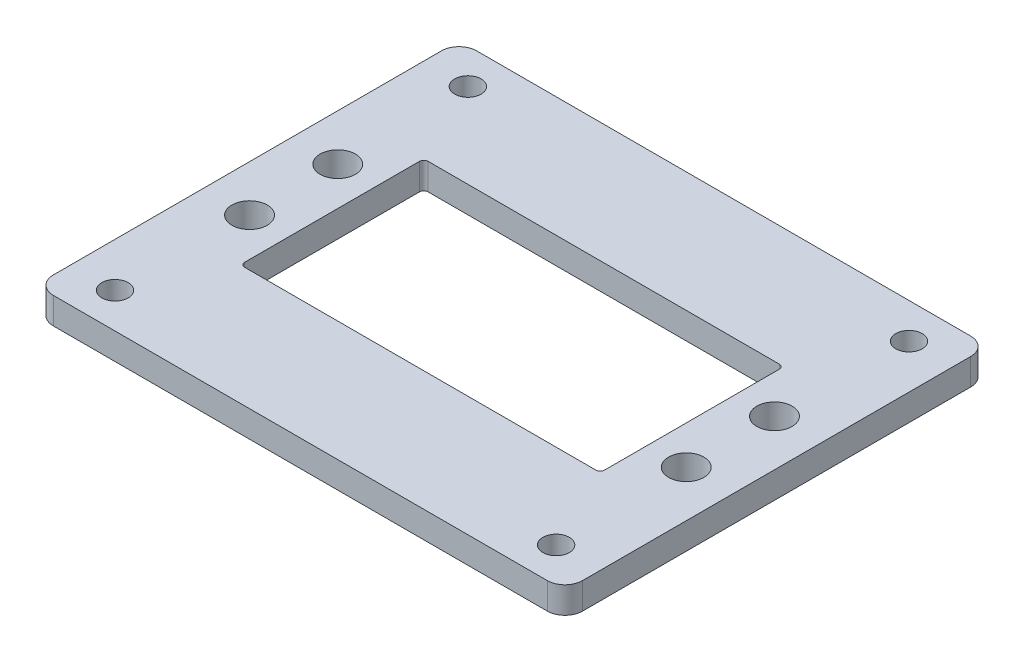
ISO-10303-21;
HEADER;
FILE_DESCRIPTION(('STEP AP214'),'2;1');
FILE_NAME('part.step','',(''),(''),'','','');
FILE_SCHEMA(('AUTOMOTIVE_DESIGN { 1 0 10303 214 1 1 1 1 }'));
ENDSEC;
DATA;
#1=APPLICATION_CONTEXT('core data for automotive mechanical design processes');
#2=APPLICATION_PROTOCOL_DEFINITION('international standard','automotive_design',2000,#1);
#3=PRODUCT_CONTEXT('',#1,'mechanical');
#4=PRODUCT('Part','Part','',(#3));
#5=PRODUCT_RELATED_PRODUCT_CATEGORY('part','',(#4));
#6=PRODUCT_DEFINITION_FORMATION('','',#4);
#7=PRODUCT_DEFINITION_CONTEXT('part definition',#1,'design');
#8=PRODUCT_DEFINITION('design','',#6,#7);
#9=PRODUCT_DEFINITION_SHAPE('','',#8);
#10=(LENGTH_UNIT() NAMED_UNIT(*) SI_UNIT(.MILLI.,.METRE.));
#11=(NAMED_UNIT(*) PLANE_ANGLE_UNIT() SI_UNIT($,.RADIAN.));
#12=(NAMED_UNIT(*) SI_UNIT($,.STERADIAN.) SOLID_ANGLE_UNIT());
#13=UNCERTAINTY_MEASURE_WITH_UNIT(LENGTH_MEASURE(1.E-05),#10,'distance_accuracy_value','');
#14=(GEOMETRIC_REPRESENTATION_CONTEXT(3) GLOBAL_UNCERTAINTY_ASSIGNED_CONTEXT((#13)) GLOBAL_UNIT_ASSIGNED_CONTEXT((#10,
#11,#12)) REPRESENTATION_CONTEXT('',''));
#15=CARTESIAN_POINT('',(0.,0.,0.));
#16=DIRECTION('',(0.,0.,1.));
#17=DIRECTION('',(1.,0.,0.));
#18=AXIS2_PLACEMENT_3D('',#15,#16,#17);
#19=CARTESIAN_POINT('',(0.,3.,0.));
#20=DIRECTION('',(0.,-1.,0.));
#21=DIRECTION('',(0.,0.,-1.));
#22=AXIS2_PLACEMENT_3D('',#19,#20,#21);
#23=PLANE('',#22);
#24=CARTESIAN_POINT('',(24.75,3.,-5.00000000000001));
#25=DIRECTION('',(0.,1.,0.));
#26=DIRECTION('',(0.,0.,1.));
#27=AXIS2_PLACEMENT_3D('',#24,#25,#26);
#28=CIRCLE('',#27,2.);
#29=CARTESIAN_POINT('',(24.75,3.,-3.));
#30=VERTEX_POINT('',#29);
#31=EDGE_CURVE('E280',#30,#30,#28,.T.);
#32=ORIENTED_EDGE('',*,*,#31,.F.);
#33=EDGE_LOOP('',(#32));
#34=FACE_BOUND('',#33,.T.);
#35=CARTESIAN_POINT('',(25.,3.,20.));
#36=DIRECTION('',(0.,1.,0.));
#37=DIRECTION('',(0.,0.,1.));
#38=AXIS2_PLACEMENT_3D('',#35,#36,#37);
#39=CIRCLE('',#38,1.5);
#40=CARTESIAN_POINT('',(25.,3.,21.5));
#41=VERTEX_POINT('',#40);
#42=EDGE_CURVE('E274',#41,#41,#39,.T.);
#43=ORIENTED_EDGE('',*,*,#42,.F.);
#44=EDGE_LOOP('',(#43));
#45=FACE_BOUND('',#44,.T.);
#46=DIRECTION('',(0.,0.,-1.));
#47=VECTOR('',#46,1.);
#48=CARTESIAN_POINT('',(30.,3.,24.));
#49=LINE('',#48,#47);
#50=CARTESIAN_POINT('',(30.,3.,22.));
#51=VERTEX_POINT('',#50);
#52=CARTESIAN_POINT('',(30.,3.,-22.));
#53=VERTEX_POINT('',#52);
#54=EDGE_CURVE('E266',#51,#53,#49,.T.);
#55=ORIENTED_EDGE('',*,*,#54,.T.);
#56=CARTESIAN_POINT('',(28.,3.,-22.));
#57=DIRECTION('',(0.,-1.,0.));
#58=DIRECTION('',(0.,0.,-1.));
#59=AXIS2_PLACEMENT_3D('',#56,#57,#58);
#60=CIRCLE('',#59,2.);
#61=CARTESIAN_POINT('',(28.,3.,-24.));
#62=VERTEX_POINT('',#61);
#63=EDGE_CURVE('E239',#53,#62,#60,.F.);
#64=ORIENTED_EDGE('',*,*,#63,.T.);
#65=DIRECTION('',(-1.,0.,0.));
#66=VECTOR('',#65,1.);
#67=CARTESIAN_POINT('',(-30.,3.,-24.));
#68=LINE('',#67,#66);
#69=CARTESIAN_POINT('',(-28.,3.,-24.));
#70=VERTEX_POINT('',#69);
#71=EDGE_CURVE('E257',#62,#70,#68,.T.);
#72=ORIENTED_EDGE('',*,*,#71,.T.);
#73=CARTESIAN_POINT('',(-28.,3.,-22.));
#74=DIRECTION('',(0.,-1.,0.));
#75=DIRECTION('',(0.,0.,-1.));
#76=AXIS2_PLACEMENT_3D('',#73,#74,#75);
#77=CIRCLE('',#76,2.);
#78=CARTESIAN_POINT('',(-30.,3.,-22.));
#79=VERTEX_POINT('',#78);
#80=EDGE_CURVE('E235',#70,#79,#77,.F.);
#81=ORIENTED_EDGE('',*,*,#80,.T.);
#82=DIRECTION('',(0.,0.,1.));
#83=VECTOR('',#82,1.);
#84=CARTESIAN_POINT('',(-30.,3.,24.));
#85=LINE('',#84,#83);
#86=CARTESIAN_POINT('',(-30.,3.,22.));
#87=VERTEX_POINT('',#86);
#88=EDGE_CURVE('E185',#79,#87,#85,.T.);
#89=ORIENTED_EDGE('',*,*,#88,.T.);
#90=CARTESIAN_POINT('',(-28.,3.,22.));
#91=DIRECTION('',(0.,-1.,0.));
#92=DIRECTION('',(0.,0.,-1.));
#93=AXIS2_PLACEMENT_3D('',#90,#91,#92);
#94=CIRCLE('',#93,2.);
#95=CARTESIAN_POINT('',(-28.,3.,24.));
#96=VERTEX_POINT('',#95);
#97=EDGE_CURVE('E62',#87,#96,#94,.F.);
#98=ORIENTED_EDGE('',*,*,#97,.T.);
#99=DIRECTION('',(1.,0.,0.));
#100=VECTOR('',#99,1.);
#101=CARTESIAN_POINT('',(-30.,3.,24.));
#102=LINE('',#101,#100);
#103=CARTESIAN_POINT('',(28.,3.,24.));
#104=VERTEX_POINT('',#103);
#105=EDGE_CURVE('E181',#96,#104,#102,.T.);
#106=ORIENTED_EDGE('',*,*,#105,.T.);
#107=CARTESIAN_POINT('',(28.,3.,22.));
#108=DIRECTION('',(0.,-1.,0.));
#109=DIRECTION('',(0.,0.,-1.));
#110=AXIS2_PLACEMENT_3D('',#107,#108,#109);
#111=CIRCLE('',#110,2.);
#112=EDGE_CURVE('E237',#104,#51,#111,.F.);
#113=ORIENTED_EDGE('',*,*,#112,.T.);
#114=EDGE_LOOP('',(#55,#64,#72,#81,#89,#98,#106,#113));
#115=FACE_BOUND('',#114,.T.);
#116=DIRECTION('',(0.,0.,-1.));
#117=VECTOR('',#116,1.);
#118=CARTESIAN_POINT('',(20.4,3.,10.4));
#119=LINE('',#118,#117);
#120=CARTESIAN_POINT('',(20.4,3.,9.9));
#121=VERTEX_POINT('',#120);
#122=CARTESIAN_POINT('',(20.4,3.,-9.9));
#123=VERTEX_POINT('',#122);
#124=EDGE_CURVE('E177',#121,#123,#119,.T.);
#125=ORIENTED_EDGE('',*,*,#124,.F.);
#126=CARTESIAN_POINT('',(19.9,3.,9.9));
#127=DIRECTION('',(0.,-1.,0.));
#128=DIRECTION('',(0.,0.,-1.));
#129=AXIS2_PLACEMENT_3D('',#126,#127,#128);
#130=CIRCLE('',#129,0.5);
#131=CARTESIAN_POINT('',(19.9,3.,10.4));
#132=VERTEX_POINT('',#131);
#133=EDGE_CURVE('E167',#121,#132,#130,.T.);
#134=ORIENTED_EDGE('',*,*,#133,.T.);
#135=DIRECTION('',(1.,0.,0.));
#136=VECTOR('',#135,1.);
#137=CARTESIAN_POINT('',(-20.4,3.,10.4));
#138=LINE('',#137,#136);
#139=CARTESIAN_POINT('',(-19.9,3.,10.4));
#140=VERTEX_POINT('',#139);
#141=EDGE_CURVE('E286',#140,#132,#138,.T.);
#142=ORIENTED_EDGE('',*,*,#141,.F.);
#143=CARTESIAN_POINT('',(-19.9,3.,9.9));
#144=DIRECTION('',(0.,-1.,0.));
#145=DIRECTION('',(0.,0.,-1.));
#146=AXIS2_PLACEMENT_3D('',#143,#144,#145);
#147=CIRCLE('',#146,0.5);
#148=CARTESIAN_POINT('',(-20.4,3.,9.9));
#149=VERTEX_POINT('',#148);
#150=EDGE_CURVE('E166',#140,#149,#147,.T.);
#151=ORIENTED_EDGE('',*,*,#150,.T.);
#152=DIRECTION('',(0.,0.,1.));
#153=VECTOR('',#152,1.);
#154=CARTESIAN_POINT('',(-20.4,3.,10.4));
#155=LINE('',#154,#153);
#156=CARTESIAN_POINT('',(-20.4,3.,-9.9));
#157=VERTEX_POINT('',#156);
#158=EDGE_CURVE('E298',#157,#149,#155,.T.);
#159=ORIENTED_EDGE('',*,*,#158,.F.);
#160=CARTESIAN_POINT('',(-19.9,3.,-9.9));
#161=DIRECTION('',(0.,-1.,0.));
#162=DIRECTION('',(0.,0.,-1.));
#163=AXIS2_PLACEMENT_3D('',#160,#161,#162);
#164=CIRCLE('',#163,0.5);
#165=CARTESIAN_POINT('',(-19.9,3.,-10.4));
#166=VERTEX_POINT('',#165);
#167=EDGE_CURVE('E214',#157,#166,#164,.T.);
#168=ORIENTED_EDGE('',*,*,#167,.T.);
#169=DIRECTION('',(-1.,0.,0.));
#170=VECTOR('',#169,1.);
#171=CARTESIAN_POINT('',(-20.4,3.,-10.4));
#172=LINE('',#171,#170);
#173=CARTESIAN_POINT('',(19.9,3.,-10.4));
#174=VERTEX_POINT('',#173);
#175=EDGE_CURVE('E301',#174,#166,#172,.T.);
#176=ORIENTED_EDGE('',*,*,#175,.F.);
#177=CARTESIAN_POINT('',(19.9,3.,-9.9));
#178=DIRECTION('',(0.,-1.,0.));
#179=DIRECTION('',(0.,0.,-1.));
#180=AXIS2_PLACEMENT_3D('',#177,#178,#179);
#181=CIRCLE('',#180,0.5);
#182=EDGE_CURVE('E210',#174,#123,#181,.T.);
#183=ORIENTED_EDGE('',*,*,#182,.T.);
#184=EDGE_LOOP('',(#125,#134,#142,#151,#159,#168,#176,#183));
#185=FACE_BOUND('',#184,.T.);
#186=CARTESIAN_POINT('',(24.75,3.,4.99999999999999));
#187=DIRECTION('',(0.,1.,0.));
#188=DIRECTION('',(0.,0.,-1.));
#189=AXIS2_PLACEMENT_3D('',#186,#187,#188);
#190=CIRCLE('',#189,2.);
#191=CARTESIAN_POINT('',(24.75,3.,2.99999999999999));
#192=VERTEX_POINT('',#191);
#193=EDGE_CURVE('E296',#192,#192,#190,.T.);
#194=ORIENTED_EDGE('',*,*,#193,.F.);
#195=EDGE_LOOP('',(#194));
#196=FACE_BOUND('',#195,.T.);
#197=CARTESIAN_POINT('',(-24.75,3.,4.99999999999999));
#198=DIRECTION('',(0.,1.,0.));
#199=DIRECTION('',(0.,0.,1.));
#200=AXIS2_PLACEMENT_3D('',#197,#198,#199);
#201=CIRCLE('',#200,2.);
#202=CARTESIAN_POINT('',(-24.75,3.,7.));
#203=VERTEX_POINT('',#202);
#204=EDGE_CURVE('E309',#203,#203,#201,.T.);
#205=ORIENTED_EDGE('',*,*,#204,.F.);
#206=EDGE_LOOP('',(#205));
#207=FACE_BOUND('',#206,.T.);
#208=CARTESIAN_POINT('',(-24.75,3.,-5.00000000000001));
#209=DIRECTION('',(0.,1.,0.));
#210=DIRECTION('',(0.,0.,-1.));
#211=AXIS2_PLACEMENT_3D('',#208,#209,#210);
#212=CIRCLE('',#211,2.);
#213=CARTESIAN_POINT('',(-24.75,3.,-7.00000000000001));
#214=VERTEX_POINT('',#213);
#215=EDGE_CURVE('E315',#214,#214,#212,.T.);
#216=ORIENTED_EDGE('',*,*,#215,.F.);
#217=EDGE_LOOP('',(#216));
#218=FACE_BOUND('',#217,.T.);
#219=CARTESIAN_POINT('',(-25.,3.,-20.));
#220=DIRECTION('',(0.,1.,0.));
#221=DIRECTION('',(0.,0.,1.));
#222=AXIS2_PLACEMENT_3D('',#219,#220,#221);
#223=CIRCLE('',#222,1.5);
#224=CARTESIAN_POINT('',(-25.,3.,-18.5));
#225=VERTEX_POINT('',#224);
#226=EDGE_CURVE('E321',#225,#225,#223,.T.);
#227=ORIENTED_EDGE('',*,*,#226,.F.);
#228=EDGE_LOOP('',(#227));
#229=FACE_BOUND('',#228,.T.);
#230=CARTESIAN_POINT('',(25.,3.,-20.));
#231=DIRECTION('',(0.,1.,0.));
#232=DIRECTION('',(0.,0.,-1.));
#233=AXIS2_PLACEMENT_3D('',#230,#231,#232);
#234=CIRCLE('',#233,1.5);
#235=CARTESIAN_POINT('',(25.,3.,-21.5));
#236=VERTEX_POINT('',#235);
#237=EDGE_CURVE('E327',#236,#236,#234,.T.);
#238=ORIENTED_EDGE('',*,*,#237,.F.);
#239=EDGE_LOOP('',(#238));
#240=FACE_BOUND('',#239,.T.);
#241=CARTESIAN_POINT('',(-25.,3.,20.));
#242=DIRECTION('',(0.,1.,0.));
#243=DIRECTION('',(0.,0.,-1.));
#244=AXIS2_PLACEMENT_3D('',#241,#242,#243);
#245=CIRCLE('',#244,1.5);
#246=CARTESIAN_POINT('',(-25.,3.,18.5));
#247=VERTEX_POINT('',#246);
#248=EDGE_CURVE('E333',#247,#247,#245,.T.);
#249=ORIENTED_EDGE('',*,*,#248,.F.);
#250=EDGE_LOOP('',(#249));
#251=FACE_BOUND('',#250,.T.);
#252=ADVANCED_FACE('F40',(#34,#45,#115,#185,#196,#207,#218,#229,#240,#251),#23,.F.);
#253=CARTESIAN_POINT('',(0.,0.,0.));
#254=DIRECTION('',(0.,-1.,0.));
#255=DIRECTION('',(0.,0.,-1.));
#256=AXIS2_PLACEMENT_3D('',#253,#254,#255);
#257=PLANE('',#256);
#258=CARTESIAN_POINT('',(25.,0.,-20.));
#259=DIRECTION('',(0.,1.,0.));
#260=DIRECTION('',(0.,0.,-1.));
#261=AXIS2_PLACEMENT_3D('',#258,#259,#260);
#262=CIRCLE('',#261,1.5);
#263=CARTESIAN_POINT('',(25.,0.,-21.5));
#264=VERTEX_POINT('',#263);
#265=EDGE_CURVE('E330',#264,#264,#262,.T.);
#266=ORIENTED_EDGE('',*,*,#265,.T.);
#267=EDGE_LOOP('',(#266));
#268=FACE_BOUND('',#267,.T.);
#269=CARTESIAN_POINT('',(-24.75,0.,-5.00000000000001));
#270=DIRECTION('',(0.,1.,0.));
#271=DIRECTION('',(0.,0.,-1.));
#272=AXIS2_PLACEMENT_3D('',#269,#270,#271);
#273=CIRCLE('',#272,2.);
#274=CARTESIAN_POINT('',(-24.75,0.,-7.00000000000001));
#275=VERTEX_POINT('',#274);
#276=EDGE_CURVE('E318',#275,#275,#273,.T.);
#277=ORIENTED_EDGE('',*,*,#276,.T.);
#278=EDGE_LOOP('',(#277));
#279=FACE_BOUND('',#278,.T.);
#280=CARTESIAN_POINT('',(24.75,0.,4.99999999999999));
#281=DIRECTION('',(0.,1.,0.));
#282=DIRECTION('',(0.,0.,-1.));
#283=AXIS2_PLACEMENT_3D('',#280,#281,#282);
#284=CIRCLE('',#283,2.);
#285=CARTESIAN_POINT('',(24.75,0.,2.99999999999999));
#286=VERTEX_POINT('',#285);
#287=EDGE_CURVE('E306',#286,#286,#284,.T.);
#288=ORIENTED_EDGE('',*,*,#287,.T.);
#289=EDGE_LOOP('',(#288));
#290=FACE_BOUND('',#289,.T.);
#291=CARTESIAN_POINT('',(25.,0.,20.));
#292=DIRECTION('',(0.,1.,0.));
#293=DIRECTION('',(0.,0.,1.));
#294=AXIS2_PLACEMENT_3D('',#291,#292,#293);
#295=CIRCLE('',#294,1.5);
#296=CARTESIAN_POINT('',(25.,0.,21.5));
#297=VERTEX_POINT('',#296);
#298=EDGE_CURVE('E277',#297,#297,#295,.T.);
#299=ORIENTED_EDGE('',*,*,#298,.T.);
#300=EDGE_LOOP('',(#299));
#301=FACE_BOUND('',#300,.T.);
#302=DIRECTION('',(-1.,0.,0.));
#303=VECTOR('',#302,1.);
#304=CARTESIAN_POINT('',(-30.,0.,-24.));
#305=LINE('',#304,#303);
#306=CARTESIAN_POINT('',(28.,0.,-24.));
#307=VERTEX_POINT('',#306);
#308=CARTESIAN_POINT('',(-28.,0.,-24.));
#309=VERTEX_POINT('',#308);
#310=EDGE_CURVE('E268',#307,#309,#305,.T.);
#311=ORIENTED_EDGE('',*,*,#310,.F.);
#312=CARTESIAN_POINT('',(28.,0.,-22.));
#313=DIRECTION('',(0.,-1.,0.));
#314=DIRECTION('',(0.,0.,-1.));
#315=AXIS2_PLACEMENT_3D('',#312,#313,#314);
#316=CIRCLE('',#315,2.);
#317=CARTESIAN_POINT('',(30.,0.,-22.));
#318=VERTEX_POINT('',#317);
#319=EDGE_CURVE('E227',#307,#318,#316,.T.);
#320=ORIENTED_EDGE('',*,*,#319,.T.);
#321=DIRECTION('',(0.,0.,-1.));
#322=VECTOR('',#321,1.);
#323=CARTESIAN_POINT('',(30.,0.,24.));
#324=LINE('',#323,#322);
#325=CARTESIAN_POINT('',(30.,0.,22.));
#326=VERTEX_POINT('',#325);
#327=EDGE_CURVE('E270',#326,#318,#324,.T.);
#328=ORIENTED_EDGE('',*,*,#327,.F.);
#329=CARTESIAN_POINT('',(28.,0.,22.));
#330=DIRECTION('',(0.,-1.,0.));
#331=DIRECTION('',(0.,0.,-1.));
#332=AXIS2_PLACEMENT_3D('',#329,#330,#331);
#333=CIRCLE('',#332,2.);
#334=CARTESIAN_POINT('',(28.,0.,24.));
#335=VERTEX_POINT('',#334);
#336=EDGE_CURVE('E225',#326,#335,#333,.T.);
#337=ORIENTED_EDGE('',*,*,#336,.T.);
#338=DIRECTION('',(1.,0.,0.));
#339=VECTOR('',#338,1.);
#340=CARTESIAN_POINT('',(-30.,0.,24.));
#341=LINE('',#340,#339);
#342=CARTESIAN_POINT('',(-28.,0.,24.));
#343=VERTEX_POINT('',#342);
#344=EDGE_CURVE('E188',#343,#335,#341,.T.);
#345=ORIENTED_EDGE('',*,*,#344,.F.);
#346=CARTESIAN_POINT('',(-28.,0.,22.));
#347=DIRECTION('',(0.,-1.,0.));
#348=DIRECTION('',(0.,0.,-1.));
#349=AXIS2_PLACEMENT_3D('',#346,#347,#348);
#350=CIRCLE('',#349,2.);
#351=CARTESIAN_POINT('',(-30.,0.,22.));
#352=VERTEX_POINT('',#351);
#353=EDGE_CURVE('E221',#343,#352,#350,.T.);
#354=ORIENTED_EDGE('',*,*,#353,.T.);
#355=DIRECTION('',(0.,0.,1.));
#356=VECTOR('',#355,1.);
#357=CARTESIAN_POINT('',(-30.,0.,24.));
#358=LINE('',#357,#356);
#359=CARTESIAN_POINT('',(-30.,0.,-22.));
#360=VERTEX_POINT('',#359);
#361=EDGE_CURVE('E251',#360,#352,#358,.T.);
#362=ORIENTED_EDGE('',*,*,#361,.F.);
#363=CARTESIAN_POINT('',(-28.,0.,-22.));
#364=DIRECTION('',(0.,-1.,0.));
#365=DIRECTION('',(0.,0.,-1.));
#366=AXIS2_PLACEMENT_3D('',#363,#364,#365);
#367=CIRCLE('',#366,2.);
#368=EDGE_CURVE('E223',#360,#309,#367,.T.);
#369=ORIENTED_EDGE('',*,*,#368,.T.);
#370=EDGE_LOOP('',(#311,#320,#328,#337,#345,#354,#362,#369));
#371=FACE_BOUND('',#370,.T.);
#372=CARTESIAN_POINT('',(24.75,0.,-5.00000000000001));
#373=DIRECTION('',(0.,1.,0.));
#374=DIRECTION('',(0.,0.,1.));
#375=AXIS2_PLACEMENT_3D('',#372,#373,#374);
#376=CIRCLE('',#375,2.);
#377=CARTESIAN_POINT('',(24.75,0.,-3.));
#378=VERTEX_POINT('',#377);
#379=EDGE_CURVE('E283',#378,#378,#376,.T.);
#380=ORIENTED_EDGE('',*,*,#379,.T.);
#381=EDGE_LOOP('',(#380));
#382=FACE_BOUND('',#381,.T.);
#383=DIRECTION('',(0.,0.,1.));
#384=VECTOR('',#383,1.);
#385=CARTESIAN_POINT('',(-20.4,0.,10.4));
#386=LINE('',#385,#384);
#387=CARTESIAN_POINT('',(-20.4,0.,-9.9));
#388=VERTEX_POINT('',#387);
#389=CARTESIAN_POINT('',(-20.4,0.,9.9));
#390=VERTEX_POINT('',#389);
#391=EDGE_CURVE('E161',#388,#390,#386,.T.);
#392=ORIENTED_EDGE('',*,*,#391,.T.);
#393=CARTESIAN_POINT('',(-19.9,0.,9.9));
#394=DIRECTION('',(0.,-1.,0.));
#395=DIRECTION('',(0.,0.,-1.));
#396=AXIS2_PLACEMENT_3D('',#393,#394,#395);
#397=CIRCLE('',#396,0.5);
#398=CARTESIAN_POINT('',(-19.9,0.,10.4));
#399=VERTEX_POINT('',#398);
#400=EDGE_CURVE('E155',#390,#399,#397,.F.);
#401=ORIENTED_EDGE('',*,*,#400,.T.);
#402=DIRECTION('',(1.,0.,0.));
#403=VECTOR('',#402,1.);
#404=CARTESIAN_POINT('',(-20.4,0.,10.4));
#405=LINE('',#404,#403);
#406=CARTESIAN_POINT('',(19.9,0.,10.4));
#407=VERTEX_POINT('',#406);
#408=EDGE_CURVE('E159',#399,#407,#405,.T.);
#409=ORIENTED_EDGE('',*,*,#408,.T.);
#410=CARTESIAN_POINT('',(19.9,0.,9.9));
#411=DIRECTION('',(0.,-1.,0.));
#412=DIRECTION('',(0.,0.,-1.));
#413=AXIS2_PLACEMENT_3D('',#410,#411,#412);
#414=CIRCLE('',#413,0.5);
#415=CARTESIAN_POINT('',(20.4,0.,9.9));
#416=VERTEX_POINT('',#415);
#417=EDGE_CURVE('E204',#407,#416,#414,.F.);
#418=ORIENTED_EDGE('',*,*,#417,.T.);
#419=DIRECTION('',(0.,0.,-1.));
#420=VECTOR('',#419,1.);
#421=CARTESIAN_POINT('',(20.4,0.,10.4));
#422=LINE('',#421,#420);
#423=CARTESIAN_POINT('',(20.4,0.,-9.9));
#424=VERTEX_POINT('',#423);
#425=EDGE_CURVE('E293',#416,#424,#422,.T.);
#426=ORIENTED_EDGE('',*,*,#425,.T.);
#427=CARTESIAN_POINT('',(19.9,0.,-9.9));
#428=DIRECTION('',(0.,-1.,0.));
#429=DIRECTION('',(0.,0.,-1.));
#430=AXIS2_PLACEMENT_3D('',#427,#428,#429);
#431=CIRCLE('',#430,0.5);
#432=CARTESIAN_POINT('',(19.9,0.,-10.4));
#433=VERTEX_POINT('',#432);
#434=EDGE_CURVE('E208',#424,#433,#431,.F.);
#435=ORIENTED_EDGE('',*,*,#434,.T.);
#436=DIRECTION('',(-1.,0.,0.));
#437=VECTOR('',#436,1.);
#438=CARTESIAN_POINT('',(-20.4,0.,-10.4));
#439=LINE('',#438,#437);
#440=CARTESIAN_POINT('',(-19.9,0.,-10.4));
#441=VERTEX_POINT('',#440);
#442=EDGE_CURVE('E290',#433,#441,#439,.T.);
#443=ORIENTED_EDGE('',*,*,#442,.T.);
#444=CARTESIAN_POINT('',(-19.9,0.,-9.9));
#445=DIRECTION('',(0.,-1.,0.));
#446=DIRECTION('',(0.,0.,-1.));
#447=AXIS2_PLACEMENT_3D('',#444,#445,#446);
#448=CIRCLE('',#447,0.5);
#449=EDGE_CURVE('E212',#441,#388,#448,.F.);
#450=ORIENTED_EDGE('',*,*,#449,.T.);
#451=EDGE_LOOP('',(#392,#401,#409,#418,#426,#435,#443,#450));
#452=FACE_BOUND('',#451,.T.);
#453=CARTESIAN_POINT('',(-24.75,0.,4.99999999999999));
#454=DIRECTION('',(0.,1.,0.));
#455=DIRECTION('',(0.,0.,1.));
#456=AXIS2_PLACEMENT_3D('',#453,#454,#455);
#457=CIRCLE('',#456,2.);
#458=CARTESIAN_POINT('',(-24.75,0.,7.));
#459=VERTEX_POINT('',#458);
#460=EDGE_CURVE('E312',#459,#459,#457,.T.);
#461=ORIENTED_EDGE('',*,*,#460,.T.);
#462=EDGE_LOOP('',(#461));
#463=FACE_BOUND('',#462,.T.);
#464=CARTESIAN_POINT('',(-25.,0.,-20.));
#465=DIRECTION('',(0.,1.,0.));
#466=DIRECTION('',(0.,0.,1.));
#467=AXIS2_PLACEMENT_3D('',#464,#465,#466);
#468=CIRCLE('',#467,1.5);
#469=CARTESIAN_POINT('',(-25.,0.,-18.5));
#470=VERTEX_POINT('',#469);
#471=EDGE_CURVE('E324',#470,#470,#468,.T.);
#472=ORIENTED_EDGE('',*,*,#471,.T.);
#473=EDGE_LOOP('',(#472));
#474=FACE_BOUND('',#473,.T.);
#475=CARTESIAN_POINT('',(-25.,0.,20.));
#476=DIRECTION('',(0.,1.,0.));
#477=DIRECTION('',(0.,0.,-1.));
#478=AXIS2_PLACEMENT_3D('',#475,#476,#477);
#479=CIRCLE('',#478,1.5);
#480=CARTESIAN_POINT('',(-25.,0.,18.5));
#481=VERTEX_POINT('',#480);
#482=EDGE_CURVE('E336',#481,#481,#479,.T.);
#483=ORIENTED_EDGE('',*,*,#482,.T.);
#484=EDGE_LOOP('',(#483));
#485=FACE_BOUND('',#484,.T.);
#486=ADVANCED_FACE('F157',(#268,#279,#290,#301,#371,#382,#452,#463,#474,#485),#257,.T.);
#487=CARTESIAN_POINT('',(30.,3.,24.));
#488=DIRECTION('',(-1.,0.,0.));
#489=DIRECTION('',(0.,0.,1.));
#490=AXIS2_PLACEMENT_3D('',#487,#488,#489);
#491=PLANE('',#490);
#492=ORIENTED_EDGE('',*,*,#327,.T.);
#493=DIRECTION('',(0.,-1.,0.));
#494=VECTOR('',#493,1.);
#495=CARTESIAN_POINT('',(30.,3.,-22.));
#496=LINE('',#495,#494);
#497=EDGE_CURVE('E232',#318,#53,#496,.F.);
#498=ORIENTED_EDGE('',*,*,#497,.T.);
#499=ORIENTED_EDGE('',*,*,#54,.F.);
#500=DIRECTION('',(0.,-1.,0.));
#501=VECTOR('',#500,1.);
#502=CARTESIAN_POINT('',(30.,3.,22.));
#503=LINE('',#502,#501);
#504=EDGE_CURVE('E229',#51,#326,#503,.T.);
#505=ORIENTED_EDGE('',*,*,#504,.T.);
#506=EDGE_LOOP('',(#492,#498,#499,#505));
#507=FACE_BOUND('',#506,.T.);
#508=ADVANCED_FACE('F351',(#507),#491,.F.);
#509=CARTESIAN_POINT('',(-30.,3.,-24.));
#510=DIRECTION('',(0.,0.,1.));
#511=DIRECTION('',(1.,0.,0.));
#512=AXIS2_PLACEMENT_3D('',#509,#510,#511);
#513=PLANE('',#512);
#514=ORIENTED_EDGE('',*,*,#71,.F.);
#515=DIRECTION('',(0.,-1.,0.));
#516=VECTOR('',#515,1.);
#517=CARTESIAN_POINT('',(28.,3.,-24.));
#518=LINE('',#517,#516);
#519=EDGE_CURVE('E218',#62,#307,#518,.T.);
#520=ORIENTED_EDGE('',*,*,#519,.T.);
#521=ORIENTED_EDGE('',*,*,#310,.T.);
#522=DIRECTION('',(0.,-1.,0.));
#523=VECTOR('',#522,1.);
#524=CARTESIAN_POINT('',(-28.,3.,-24.));
#525=LINE('',#524,#523);
#526=EDGE_CURVE('E216',#309,#70,#525,.F.);
#527=ORIENTED_EDGE('',*,*,#526,.T.);
#528=EDGE_LOOP('',(#514,#520,#521,#527));
#529=FACE_BOUND('',#528,.T.);
#530=ADVANCED_FACE('F364',(#529),#513,.F.);
#531=CARTESIAN_POINT('',(-30.,3.,24.));
#532=DIRECTION('',(1.,0.,0.));
#533=DIRECTION('',(0.,0.,-1.));
#534=AXIS2_PLACEMENT_3D('',#531,#532,#533);
#535=PLANE('',#534);
#536=ORIENTED_EDGE('',*,*,#88,.F.);
#537=DIRECTION('',(0.,-1.,0.));
#538=VECTOR('',#537,1.);
#539=CARTESIAN_POINT('',(-30.,3.,-22.));
#540=LINE('',#539,#538);
#541=EDGE_CURVE('E11',#79,#360,#540,.T.);
#542=ORIENTED_EDGE('',*,*,#541,.T.);
#543=ORIENTED_EDGE('',*,*,#361,.T.);
#544=DIRECTION('',(0.,-1.,0.));
#545=VECTOR('',#544,1.);
#546=CARTESIAN_POINT('',(-30.,3.,22.));
#547=LINE('',#546,#545);
#548=EDGE_CURVE('E48',#352,#87,#547,.F.);
#549=ORIENTED_EDGE('',*,*,#548,.T.);
#550=EDGE_LOOP('',(#536,#542,#543,#549));
#551=FACE_BOUND('',#550,.T.);
#552=ADVANCED_FACE('F248',(#551),#535,.F.);
#553=CARTESIAN_POINT('',(-30.,3.,24.));
#554=DIRECTION('',(0.,0.,-1.));
#555=DIRECTION('',(-1.,0.,0.));
#556=AXIS2_PLACEMENT_3D('',#553,#554,#555);
#557=PLANE('',#556);
#558=ORIENTED_EDGE('',*,*,#344,.T.);
#559=DIRECTION('',(0.,-1.,0.));
#560=VECTOR('',#559,1.);
#561=CARTESIAN_POINT('',(28.,3.,24.));
#562=LINE('',#561,#560);
#563=EDGE_CURVE('E55',#335,#104,#562,.F.);
#564=ORIENTED_EDGE('',*,*,#563,.T.);
#565=ORIENTED_EDGE('',*,*,#105,.F.);
#566=DIRECTION('',(0.,-1.,0.));
#567=VECTOR('',#566,1.);
#568=CARTESIAN_POINT('',(-28.,3.,24.));
#569=LINE('',#568,#567);
#570=EDGE_CURVE('E241',#96,#343,#569,.T.);
#571=ORIENTED_EDGE('',*,*,#570,.T.);
#572=EDGE_LOOP('',(#558,#564,#565,#571));
#573=FACE_BOUND('',#572,.T.);
#574=ADVANCED_FACE('F261',(#573),#557,.F.);
#575=CARTESIAN_POINT('',(25.,3.,20.));
#576=DIRECTION('',(0.,-1.,0.));
#577=DIRECTION('',(0.,0.,-1.));
#578=AXIS2_PLACEMENT_3D('',#575,#576,#577);
#579=CYLINDRICAL_SURFACE('',#578,1.5);
#580=ORIENTED_EDGE('',*,*,#42,.T.);
#581=EDGE_LOOP('',(#580));
#582=FACE_BOUND('',#581,.T.);
#583=ORIENTED_EDGE('',*,*,#298,.F.);
#584=EDGE_LOOP('',(#583));
#585=FACE_BOUND('',#584,.T.);
#586=ADVANCED_FACE('F357',(#582,#585),#579,.F.);
#587=CARTESIAN_POINT('',(24.75,3.,-5.00000000000001));
#588=DIRECTION('',(0.,-1.,0.));
#589=DIRECTION('',(0.,0.,-1.));
#590=AXIS2_PLACEMENT_3D('',#587,#588,#589);
#591=CYLINDRICAL_SURFACE('',#590,2.);
#592=ORIENTED_EDGE('',*,*,#31,.T.);
#593=EDGE_LOOP('',(#592));
#594=FACE_BOUND('',#593,.T.);
#595=ORIENTED_EDGE('',*,*,#379,.F.);
#596=EDGE_LOOP('',(#595));
#597=FACE_BOUND('',#596,.T.);
#598=ADVANCED_FACE('F544',(#594,#597),#591,.F.);
#599=CARTESIAN_POINT('',(20.4,3.,10.4));
#600=DIRECTION('',(-1.,0.,0.));
#601=DIRECTION('',(0.,0.,1.));
#602=AXIS2_PLACEMENT_3D('',#599,#600,#601);
#603=PLANE('',#602);
#604=ORIENTED_EDGE('',*,*,#425,.F.);
#605=DIRECTION('',(0.,-1.,0.));
#606=VECTOR('',#605,1.);
#607=CARTESIAN_POINT('',(20.4,3.,9.9));
#608=LINE('',#607,#606);
#609=EDGE_CURVE('E193',#416,#121,#608,.F.);
#610=ORIENTED_EDGE('',*,*,#609,.T.);
#611=ORIENTED_EDGE('',*,*,#124,.T.);
#612=DIRECTION('',(0.,-1.,0.));
#613=VECTOR('',#612,1.);
#614=CARTESIAN_POINT('',(20.4,0.,-9.9));
#615=LINE('',#614,#613);
#616=EDGE_CURVE('E183',#123,#424,#615,.T.);
#617=ORIENTED_EDGE('',*,*,#616,.T.);
#618=EDGE_LOOP('',(#604,#610,#611,#617));
#619=FACE_BOUND('',#618,.T.);
#620=ADVANCED_FACE('F533',(#619),#603,.T.);
#621=CARTESIAN_POINT('',(-20.4,3.,-10.4));
#622=DIRECTION('',(0.,0.,1.));
#623=DIRECTION('',(1.,0.,0.));
#624=AXIS2_PLACEMENT_3D('',#621,#622,#623);
#625=PLANE('',#624);
#626=ORIENTED_EDGE('',*,*,#442,.F.);
#627=DIRECTION('',(0.,-1.,0.));
#628=VECTOR('',#627,1.);
#629=CARTESIAN_POINT('',(19.9,3.,-10.4));
#630=LINE('',#629,#628);
#631=EDGE_CURVE('E202',#433,#174,#630,.F.);
#632=ORIENTED_EDGE('',*,*,#631,.T.);
#633=ORIENTED_EDGE('',*,*,#175,.T.);
#634=DIRECTION('',(0.,-1.,0.));
#635=VECTOR('',#634,1.);
#636=CARTESIAN_POINT('',(-19.9,0.,-10.4));
#637=LINE('',#636,#635);
#638=EDGE_CURVE('E199',#166,#441,#637,.T.);
#639=ORIENTED_EDGE('',*,*,#638,.T.);
#640=EDGE_LOOP('',(#626,#632,#633,#639));
#641=FACE_BOUND('',#640,.T.);
#642=ADVANCED_FACE('F522',(#641),#625,.T.);
#643=CARTESIAN_POINT('',(-20.4,3.,10.4));
#644=DIRECTION('',(1.,0.,0.));
#645=DIRECTION('',(0.,0.,-1.));
#646=AXIS2_PLACEMENT_3D('',#643,#644,#645);
#647=PLANE('',#646);
#648=ORIENTED_EDGE('',*,*,#158,.T.);
#649=DIRECTION('',(0.,-1.,0.));
#650=VECTOR('',#649,1.);
#651=CARTESIAN_POINT('',(-20.4,0.,9.9));
#652=LINE('',#651,#650);
#653=EDGE_CURVE('E197',#149,#390,#652,.T.);
#654=ORIENTED_EDGE('',*,*,#653,.T.);
#655=ORIENTED_EDGE('',*,*,#391,.F.);
#656=DIRECTION('',(0.,-1.,0.));
#657=VECTOR('',#656,1.);
#658=CARTESIAN_POINT('',(-20.4,3.,-9.9));
#659=LINE('',#658,#657);
#660=EDGE_CURVE('E195',#388,#157,#659,.F.);
#661=ORIENTED_EDGE('',*,*,#660,.T.);
#662=EDGE_LOOP('',(#648,#654,#655,#661));
#663=FACE_BOUND('',#662,.T.);
#664=ADVANCED_FACE('F510',(#663),#647,.T.);
#665=CARTESIAN_POINT('',(-20.4,3.,10.4));
#666=DIRECTION('',(0.,0.,-1.));
#667=DIRECTION('',(-1.,0.,0.));
#668=AXIS2_PLACEMENT_3D('',#665,#666,#667);
#669=PLANE('',#668);
#670=ORIENTED_EDGE('',*,*,#141,.T.);
#671=DIRECTION('',(0.,-1.,0.));
#672=VECTOR('',#671,1.);
#673=CARTESIAN_POINT('',(19.9,0.,10.4));
#674=LINE('',#673,#672);
#675=EDGE_CURVE('E176',#132,#407,#674,.T.);
#676=ORIENTED_EDGE('',*,*,#675,.T.);
#677=ORIENTED_EDGE('',*,*,#408,.F.);
#678=DIRECTION('',(0.,-1.,0.));
#679=VECTOR('',#678,1.);
#680=CARTESIAN_POINT('',(-19.9,3.,10.4));
#681=LINE('',#680,#679);
#682=EDGE_CURVE('E173',#399,#140,#681,.F.);
#683=ORIENTED_EDGE('',*,*,#682,.T.);
#684=EDGE_LOOP('',(#670,#676,#677,#683));
#685=FACE_BOUND('',#684,.T.);
#686=ADVANCED_FACE('F172',(#685),#669,.T.);
#687=CARTESIAN_POINT('',(24.75,3.,4.99999999999999));
#688=DIRECTION('',(0.,-1.,0.));
#689=DIRECTION('',(0.,0.,-1.));
#690=AXIS2_PLACEMENT_3D('',#687,#688,#689);
#691=CYLINDRICAL_SURFACE('',#690,2.);
#692=ORIENTED_EDGE('',*,*,#193,.T.);
#693=EDGE_LOOP('',(#692));
#694=FACE_BOUND('',#693,.T.);
#695=ORIENTED_EDGE('',*,*,#287,.F.);
#696=EDGE_LOOP('',(#695));
#697=FACE_BOUND('',#696,.T.);
#698=ADVANCED_FACE('F509',(#694,#697),#691,.F.);
#699=CARTESIAN_POINT('',(-24.75,3.,4.99999999999999));
#700=DIRECTION('',(0.,-1.,0.));
#701=DIRECTION('',(0.,0.,-1.));
#702=AXIS2_PLACEMENT_3D('',#699,#700,#701);
#703=CYLINDRICAL_SURFACE('',#702,2.);
#704=ORIENTED_EDGE('',*,*,#204,.T.);
#705=EDGE_LOOP('',(#704));
#706=FACE_BOUND('',#705,.T.);
#707=ORIENTED_EDGE('',*,*,#460,.F.);
#708=EDGE_LOOP('',(#707));
#709=FACE_BOUND('',#708,.T.);
#710=ADVANCED_FACE('F587',(#706,#709),#703,.F.);
#711=CARTESIAN_POINT('',(-24.75,3.,-5.00000000000001));
#712=DIRECTION('',(0.,-1.,0.));
#713=DIRECTION('',(0.,0.,-1.));
#714=AXIS2_PLACEMENT_3D('',#711,#712,#713);
#715=CYLINDRICAL_SURFACE('',#714,2.);
#716=ORIENTED_EDGE('',*,*,#215,.T.);
#717=EDGE_LOOP('',(#716));
#718=FACE_BOUND('',#717,.T.);
#719=ORIENTED_EDGE('',*,*,#276,.F.);
#720=EDGE_LOOP('',(#719));
#721=FACE_BOUND('',#720,.T.);
#722=ADVANCED_FACE('F576',(#718,#721),#715,.F.);
#723=CARTESIAN_POINT('',(-25.,3.,-20.));
#724=DIRECTION('',(0.,-1.,0.));
#725=DIRECTION('',(0.,0.,-1.));
#726=AXIS2_PLACEMENT_3D('',#723,#724,#725);
#727=CYLINDRICAL_SURFACE('',#726,1.5);
#728=ORIENTED_EDGE('',*,*,#226,.T.);
#729=EDGE_LOOP('',(#728));
#730=FACE_BOUND('',#729,.T.);
#731=ORIENTED_EDGE('',*,*,#471,.F.);
#732=EDGE_LOOP('',(#731));
#733=FACE_BOUND('',#732,.T.);
#734=ADVANCED_FACE('F565',(#730,#733),#727,.F.);
#735=CARTESIAN_POINT('',(25.,3.,-20.));
#736=DIRECTION('',(0.,-1.,0.));
#737=DIRECTION('',(0.,0.,-1.));
#738=AXIS2_PLACEMENT_3D('',#735,#736,#737);
#739=CYLINDRICAL_SURFACE('',#738,1.5);
#740=ORIENTED_EDGE('',*,*,#237,.T.);
#741=EDGE_LOOP('',(#740));
#742=FACE_BOUND('',#741,.T.);
#743=ORIENTED_EDGE('',*,*,#265,.F.);
#744=EDGE_LOOP('',(#743));
#745=FACE_BOUND('',#744,.T.);
#746=ADVANCED_FACE('F555',(#742,#745),#739,.F.);
#747=CARTESIAN_POINT('',(-25.,3.,20.));
#748=DIRECTION('',(0.,-1.,0.));
#749=DIRECTION('',(0.,0.,-1.));
#750=AXIS2_PLACEMENT_3D('',#747,#748,#749);
#751=CYLINDRICAL_SURFACE('',#750,1.5);
#752=ORIENTED_EDGE('',*,*,#248,.T.);
#753=EDGE_LOOP('',(#752));
#754=FACE_BOUND('',#753,.T.);
#755=ORIENTED_EDGE('',*,*,#482,.F.);
#756=EDGE_LOOP('',(#755));
#757=FACE_BOUND('',#756,.T.);
#758=ADVANCED_FACE('F342',(#754,#757),#751,.F.);
#759=CARTESIAN_POINT('',(19.9,3.,9.9));
#760=DIRECTION('',(0.,1.,0.));
#761=DIRECTION('',(0.,0.,1.));
#762=AXIS2_PLACEMENT_3D('',#759,#760,#761);
#763=CYLINDRICAL_SURFACE('',#762,0.5);
#764=ORIENTED_EDGE('',*,*,#133,.F.);
#765=ORIENTED_EDGE('',*,*,#609,.F.);
#766=ORIENTED_EDGE('',*,*,#417,.F.);
#767=ORIENTED_EDGE('',*,*,#675,.F.);
#768=EDGE_LOOP('',(#764,#765,#766,#767));
#769=FACE_BOUND('',#768,.T.);
#770=ADVANCED_FACE('F371',(#769),#763,.F.);
#771=CARTESIAN_POINT('',(-19.9,3.,9.9));
#772=DIRECTION('',(0.,1.,0.));
#773=DIRECTION('',(0.,0.,1.));
#774=AXIS2_PLACEMENT_3D('',#771,#772,#773);
#775=CYLINDRICAL_SURFACE('',#774,0.5);
#776=ORIENTED_EDGE('',*,*,#150,.F.);
#777=ORIENTED_EDGE('',*,*,#682,.F.);
#778=ORIENTED_EDGE('',*,*,#400,.F.);
#779=ORIENTED_EDGE('',*,*,#653,.F.);
#780=EDGE_LOOP('',(#776,#777,#778,#779));
#781=FACE_BOUND('',#780,.T.);
#782=ADVANCED_FACE('F180',(#781),#775,.F.);
#783=CARTESIAN_POINT('',(19.9,3.,-9.9));
#784=DIRECTION('',(0.,1.,0.));
#785=DIRECTION('',(0.,0.,1.));
#786=AXIS2_PLACEMENT_3D('',#783,#784,#785);
#787=CYLINDRICAL_SURFACE('',#786,0.5);
#788=ORIENTED_EDGE('',*,*,#182,.F.);
#789=ORIENTED_EDGE('',*,*,#631,.F.);
#790=ORIENTED_EDGE('',*,*,#434,.F.);
#791=ORIENTED_EDGE('',*,*,#616,.F.);
#792=EDGE_LOOP('',(#788,#789,#790,#791));
#793=FACE_BOUND('',#792,.T.);
#794=ADVANCED_FACE('F377',(#793),#787,.F.);
#795=CARTESIAN_POINT('',(-19.9,3.,-9.9));
#796=DIRECTION('',(0.,1.,0.));
#797=DIRECTION('',(0.,0.,1.));
#798=AXIS2_PLACEMENT_3D('',#795,#796,#797);
#799=CYLINDRICAL_SURFACE('',#798,0.5);
#800=ORIENTED_EDGE('',*,*,#167,.F.);
#801=ORIENTED_EDGE('',*,*,#660,.F.);
#802=ORIENTED_EDGE('',*,*,#449,.F.);
#803=ORIENTED_EDGE('',*,*,#638,.F.);
#804=EDGE_LOOP('',(#800,#801,#802,#803));
#805=FACE_BOUND('',#804,.T.);
#806=ADVANCED_FACE('F380',(#805),#799,.F.);
#807=CARTESIAN_POINT('',(28.,3.,-22.));
#808=DIRECTION('',(0.,-1.,0.));
#809=DIRECTION('',(0.,0.,-1.));
#810=AXIS2_PLACEMENT_3D('',#807,#808,#809);
#811=CYLINDRICAL_SURFACE('',#810,2.);
#812=ORIENTED_EDGE('',*,*,#63,.F.);
#813=ORIENTED_EDGE('',*,*,#497,.F.);
#814=ORIENTED_EDGE('',*,*,#319,.F.);
#815=ORIENTED_EDGE('',*,*,#519,.F.);
#816=EDGE_LOOP('',(#812,#813,#814,#815));
#817=FACE_BOUND('',#816,.T.);
#818=ADVANCED_FACE('F384',(#817),#811,.T.);
#819=CARTESIAN_POINT('',(28.,3.,22.));
#820=DIRECTION('',(0.,-1.,0.));
#821=DIRECTION('',(0.,0.,-1.));
#822=AXIS2_PLACEMENT_3D('',#819,#820,#821);
#823=CYLINDRICAL_SURFACE('',#822,2.);
#824=ORIENTED_EDGE('',*,*,#112,.F.);
#825=ORIENTED_EDGE('',*,*,#563,.F.);
#826=ORIENTED_EDGE('',*,*,#336,.F.);
#827=ORIENTED_EDGE('',*,*,#504,.F.);
#828=EDGE_LOOP('',(#824,#825,#826,#827));
#829=FACE_BOUND('',#828,.T.);
#830=ADVANCED_FACE('F388',(#829),#823,.T.);
#831=CARTESIAN_POINT('',(-28.,3.,-22.));
#832=DIRECTION('',(0.,-1.,0.));
#833=DIRECTION('',(0.,0.,-1.));
#834=AXIS2_PLACEMENT_3D('',#831,#832,#833);
#835=CYLINDRICAL_SURFACE('',#834,2.);
#836=ORIENTED_EDGE('',*,*,#80,.F.);
#837=ORIENTED_EDGE('',*,*,#526,.F.);
#838=ORIENTED_EDGE('',*,*,#368,.F.);
#839=ORIENTED_EDGE('',*,*,#541,.F.);
#840=EDGE_LOOP('',(#836,#837,#838,#839));
#841=FACE_BOUND('',#840,.T.);
#842=ADVANCED_FACE('F391',(#841),#835,.T.);
#843=CARTESIAN_POINT('',(-28.,3.,22.));
#844=DIRECTION('',(0.,-1.,0.));
#845=DIRECTION('',(0.,0.,-1.));
#846=AXIS2_PLACEMENT_3D('',#843,#844,#845);
#847=CYLINDRICAL_SURFACE('',#846,2.);
#848=ORIENTED_EDGE('',*,*,#97,.F.);
#849=ORIENTED_EDGE('',*,*,#548,.F.);
#850=ORIENTED_EDGE('',*,*,#353,.F.);
#851=ORIENTED_EDGE('',*,*,#570,.F.);
#852=EDGE_LOOP('',(#848,#849,#850,#851));
#853=FACE_BOUND('',#852,.T.);
#854=ADVANCED_FACE('F42',(#853),#847,.T.);
#855=CLOSED_SHELL('',(#252,#486,#508,#530,#552,#574,#586,#598,#620,#642,#664,#686,#698,#710,
#722,#734,#746,#758,#770,#782,#794,#806,#818,#830,#842,#854));
#856=MANIFOLD_SOLID_BREP('B2',#855);
#857=ADVANCED_BREP_SHAPE_REPRESENTATION('',(#18,#856),#14);
#858=SHAPE_DEFINITION_REPRESENTATION(#9,#857);
ENDSEC;
END-ISO-10303-21;
